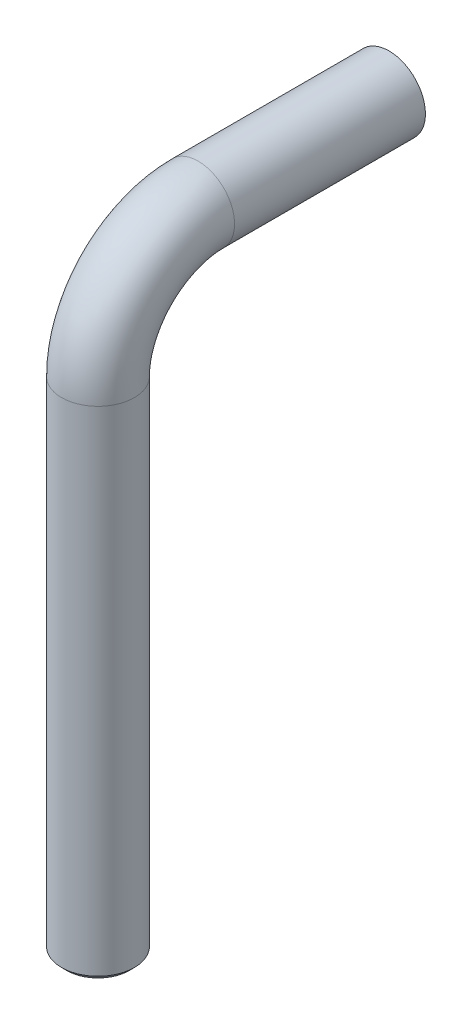
ISO-10303-21;
HEADER;
FILE_DESCRIPTION(('STEP AP214'),'2;1');
FILE_NAME('part.step','',(''),(''),'','','');
FILE_SCHEMA(('AUTOMOTIVE_DESIGN { 1 0 10303 214 1 1 1 1 }'));
ENDSEC;
DATA;
#1=APPLICATION_CONTEXT('core data for automotive mechanical design processes');
#2=APPLICATION_PROTOCOL_DEFINITION('international standard','automotive_design',2000,#1);
#3=PRODUCT_CONTEXT('',#1,'mechanical');
#4=PRODUCT('Part','Part','',(#3));
#5=PRODUCT_RELATED_PRODUCT_CATEGORY('part','',(#4));
#6=PRODUCT_DEFINITION_FORMATION('','',#4);
#7=PRODUCT_DEFINITION_CONTEXT('part definition',#1,'design');
#8=PRODUCT_DEFINITION('design','',#6,#7);
#9=PRODUCT_DEFINITION_SHAPE('','',#8);
#10=(LENGTH_UNIT() NAMED_UNIT(*) SI_UNIT(.MILLI.,.METRE.));
#11=(NAMED_UNIT(*) PLANE_ANGLE_UNIT() SI_UNIT($,.RADIAN.));
#12=(NAMED_UNIT(*) SI_UNIT($,.STERADIAN.) SOLID_ANGLE_UNIT());
#13=UNCERTAINTY_MEASURE_WITH_UNIT(LENGTH_MEASURE(1.E-05),#10,'distance_accuracy_value','');
#14=(GEOMETRIC_REPRESENTATION_CONTEXT(3) GLOBAL_UNCERTAINTY_ASSIGNED_CONTEXT((#13)) GLOBAL_UNIT_ASSIGNED_CONTEXT((#10,
#11,#12)) REPRESENTATION_CONTEXT('',''));
#15=CARTESIAN_POINT('',(0.,0.,0.));
#16=DIRECTION('',(0.,0.,1.));
#17=DIRECTION('',(1.,0.,0.));
#18=AXIS2_PLACEMENT_3D('',#15,#16,#17);
#19=CARTESIAN_POINT('',(7.084,-7.084,0.));
#20=DIRECTION('',(0.,0.,-1.));
#21=DIRECTION('',(-1.,0.,0.));
#22=AXIS2_PLACEMENT_3D('',#19,#20,#21);
#23=PLANE('',#22);
#24=CARTESIAN_POINT('',(-7.,-1.91429941660033E-09,0.));
#25=CARTESIAN_POINT('',(-6.99999891509851,0.196537843364104,0.));
#26=CARTESIAN_POINT('',(-6.99171583277586,0.393111316923906,0.));
#27=CARTESIAN_POINT('',(-6.95863478243086,0.784902996405907,0.));
#28=CARTESIAN_POINT('',(-6.93383193869678,0.980120785012645,0.));
#29=CARTESIAN_POINT('',(-6.86783123658557,1.368089954953,0.));
#30=CARTESIAN_POINT('',(-6.82660735302091,1.56083691741882,0.));
#31=CARTESIAN_POINT('',(-6.7280179483323,1.94232350827592,0.));
#32=CARTESIAN_POINT('',(-6.67063932812044,2.13105975044892,0.));
#33=CARTESIAN_POINT('',(-6.54027609809834,2.50269830515233,0.));
#34=CARTESIAN_POINT('',(-6.46731852835665,2.68561010287559,0.));
#35=CARTESIAN_POINT('',(-6.30622093211251,3.04472057343403,0.));
#36=CARTESIAN_POINT('',(-6.21807404509193,3.22091616867288,0.));
#37=CARTESIAN_POINT('',(-6.02724393962142,3.56526003396931,0.));
#38=CARTESIAN_POINT('',(-5.92456017435632,3.73340800099105,0.));
#39=CARTESIAN_POINT('',(-5.70543879336831,4.06037952617178,0.));
#40=CARTESIAN_POINT('',(-5.58900741164614,4.2192072621471,0.));
#41=CARTESIAN_POINT('',(-5.3431015333083,4.52659138815728,0.));
#42=CARTESIAN_POINT('',(-5.21361865727475,4.67514107487068,0.));
#43=CARTESIAN_POINT('',(-4.94272477354184,4.96066133858248,0.));
#44=CARTESIAN_POINT('',(-4.80132538672348,5.09764294149686,0.));
#45=CARTESIAN_POINT('',(-4.50742847418091,5.35927350480671,0.));
#46=CARTESIAN_POINT('',(-4.35492595010818,5.48391685050972,0.));
#47=CARTESIAN_POINT('',(-4.03992693399899,5.71994163914791,0.));
#48=CARTESIAN_POINT('',(-3.87742813542729,5.83132000379004,0.));
#49=CARTESIAN_POINT('',(-3.54368055722162,6.0399539706526,0.));
#50=CARTESIAN_POINT('',(-3.37243475130826,6.13721432993625,0.));
#51=CARTESIAN_POINT('',(-3.02229506377335,6.31699903732685,0.));
#52=CARTESIAN_POINT('',(-2.84339838718572,6.3995179421954,0.));
#53=CARTESIAN_POINT('',(-2.47935795885249,6.54916017127648,0.));
#54=CARTESIAN_POINT('',(-2.29421661919292,6.61628936359377,0.));
#55=CARTESIAN_POINT('',(-1.91886742245351,6.73473767043591,0.));
#56=CARTESIAN_POINT('',(-1.72865769506266,6.78605085832031,0.));
#57=CARTESIAN_POINT('',(-1.3446696181136,6.87245049550629,0.));
#58=CARTESIAN_POINT('',(-1.15089275696516,6.90754356003006,0.));
#59=CARTESIAN_POINT('',(-0.760983453149633,6.96129667140605,0.));
#60=CARTESIAN_POINT('',(-0.564849982830857,6.97994926434688,0.));
#61=CARTESIAN_POINT('',(-0.17170886107243,7.0006616332308,0.));
#62=CARTESIAN_POINT('',(0.0252987903672222,7.00272140917389,0.));
#63=CARTESIAN_POINT('',(0.418697806180246,6.99023635643656,0.));
#64=CARTESIAN_POINT('',(0.615089409281938,6.97569904838587,0.));
#65=CARTESIAN_POINT('',(1.00603037545227,6.93012601343414,0.));
#66=CARTESIAN_POINT('',(1.20057895345833,6.89908355153457,0.));
#67=CARTESIAN_POINT('',(1.58629644040987,6.82073151807987,0.));
#68=CARTESIAN_POINT('',(1.77746658655911,6.77342803688245,0.));
#69=CARTESIAN_POINT('',(2.15521567208457,6.66286647679002,0.));
#70=CARTESIAN_POINT('',(2.34179282933049,6.59960230882084,0.));
#71=CARTESIAN_POINT('',(2.70888540741974,6.4576044887307,0.));
#72=CARTESIAN_POINT('',(2.88940303579748,6.37887654340142,0.));
#73=CARTESIAN_POINT('',(3.24322564239427,6.20646673756665,0.));
#74=CARTESIAN_POINT('',(3.4165281632127,6.11277983386307,0.));
#75=CARTESIAN_POINT('',(3.75458414244703,5.91116079729822,0.));
#76=CARTESIAN_POINT('',(3.9193395711717,5.8032319680526,0.));
#77=CARTESIAN_POINT('',(4.23910084322865,5.57393156301064,0.));
#78=CARTESIAN_POINT('',(4.39411106726421,5.45256609603564,0.));
#79=CARTESIAN_POINT('',(4.69350691037047,5.19709115330211,0.));
#80=CARTESIAN_POINT('',(4.83788213146208,5.06296949157914,0.));
#81=CARTESIAN_POINT('',(5.11472568875869,4.78312605908963,0.));
#82=CARTESIAN_POINT('',(5.24720165362922,4.63741183501937,0.));
#83=CARTESIAN_POINT('',(5.49946717453756,4.33527500368971,0.));
#84=CARTESIAN_POINT('',(5.61925097007774,4.1788475866921,0.));
#85=CARTESIAN_POINT('',(5.84520726613122,3.8564618255379,0.));
#86=CARTESIAN_POINT('',(5.95138027859047,3.69050384019727,0.));
#87=CARTESIAN_POINT('',(6.14932029190583,3.35030901850082,0.));
#88=CARTESIAN_POINT('',(6.24109379191638,3.17607596358646,0.));
#89=CARTESIAN_POINT('',(6.40978599467957,2.82019293812676,0.));
#90=CARTESIAN_POINT('',(6.48667880373029,2.63853069360937,0.));
#91=CARTESIAN_POINT('',(6.62480787986965,2.26951545267121,0.));
#92=CARTESIAN_POINT('',(6.68605681771731,2.08216720013533,0.));
#93=CARTESIAN_POINT('',(6.79245876905863,1.70328094510092,0.));
#94=CARTESIAN_POINT('',(6.8376371993455,1.51175007165545,0.));
#95=CARTESIAN_POINT('',(6.91170339676888,1.12560337103086,0.));
#96=CARTESIAN_POINT('',(6.94059596877539,0.930988471181963,0.));
#97=CARTESIAN_POINT('',(6.97415548049398,0.613393017569114,0.));
#98=CARTESIAN_POINT('',(6.98384414946197,0.490921235047915,0.));
#99=CARTESIAN_POINT('',(6.99676674823848,0.245637606525265,0.));
#100=CARTESIAN_POINT('',(7.00000067804701,0.122825760523812,0.));
#101=CARTESIAN_POINT('',(6.999998915033,-0.196537845698365,0.));
#102=CARTESIAN_POINT('',(6.99171583264476,-0.393111319255954,0.));
#103=CARTESIAN_POINT('',(6.95863478216895,-0.784902998727887,0.));
#104=CARTESIAN_POINT('',(6.93383193836967,-0.980120787326772,0.));
#105=CARTESIAN_POINT('',(6.867831236129,-1.36808995724492,0.));
#106=CARTESIAN_POINT('',(6.82660735250015,-1.56083691969639,0.));
#107=CARTESIAN_POINT('',(6.72801794768457,-1.94232351051955,0.));
#108=CARTESIAN_POINT('',(6.67063932740992,-2.13105975267294,0.));
#109=CARTESIAN_POINT('',(6.5402760972641,-2.50269830733243,0.));
#110=CARTESIAN_POINT('',(6.46731852746144,-2.68561010503139,0.));
#111=CARTESIAN_POINT('',(6.30622093109758,-3.04472057553614,0.));
#112=CARTESIAN_POINT('',(6.21807404401827,-3.22091617074562,0.));
#113=CARTESIAN_POINT('',(6.02724393843297,-3.56526003597845,0.));
#114=CARTESIAN_POINT('',(5.92456017311182,-3.73340800296595,0.));
#115=CARTESIAN_POINT('',(5.70543879201484,-4.06037952807361,0.));
#116=CARTESIAN_POINT('',(5.58900741023973,-4.21920726401011,0.));
#117=CARTESIAN_POINT('',(5.34310153179942,-4.52659138993833,0.));
#118=CARTESIAN_POINT('',(5.21361865571633,-4.6751410766086,0.));
#119=CARTESIAN_POINT('',(4.9427247718882,-4.96066134023014,0.));
#120=CARTESIAN_POINT('',(4.80132538502416,-5.09764294309741,0.));
#121=CARTESIAN_POINT('',(4.50742847239436,-5.35927350630929,0.));
#122=CARTESIAN_POINT('',(4.35492594828011,-5.48391685196144,0.));
#123=CARTESIAN_POINT('',(4.03992693209229,-5.71994164049459,0.));
#124=CARTESIAN_POINT('',(3.87742813348349,-5.83132000508253,0.));
#125=CARTESIAN_POINT('',(3.5436805552083,-6.03995397183382,0.));
#126=CARTESIAN_POINT('',(3.37243474926254,-6.13721433106039,0.));
#127=CARTESIAN_POINT('',(3.02229506166771,-6.31699903833427,0.));
#128=CARTESIAN_POINT('',(2.84339838505258,-6.39951794314319,0.));
#129=CARTESIAN_POINT('',(2.47935795666947,-6.54916017210292,0.));
#130=CARTESIAN_POINT('',(2.29421661698751,-6.61628936435851,0.));
#131=CARTESIAN_POINT('',(1.91886742020861,-6.73473767107553,0.));
#132=CARTESIAN_POINT('',(1.72865769280065,-6.78605085889653,0.));
#133=CARTESIAN_POINT('',(1.34466961582279,-6.87245049595451,0.));
#134=CARTESIAN_POINT('',(1.15089275466264,-6.90754356041369,0.));
#135=CARTESIAN_POINT('',(0.760983450829197,-6.96129667165971,0.));
#136=CARTESIAN_POINT('',(0.564849980504203,-6.97994926453516,0.));
#137=CARTESIAN_POINT('',(0.171708858738871,-7.00066163328804,0.));
#138=CARTESIAN_POINT('',(-0.0252987927014662,-7.00272140916546,0.));
#139=CARTESIAN_POINT('',(-0.418697808510325,-6.99023635629699,0.));
#140=CARTESIAN_POINT('',(-0.61508941160717,-6.97569904818084,0.));
#141=CARTESIAN_POINT('',(-1.00603037776231,-6.9301260130988,0.));
#142=CARTESIAN_POINT('',(-1.20057895575801,-6.89908355113438,0.));
#143=CARTESIAN_POINT('',(-1.58629644268342,-6.82073151755111,0.));
#144=CARTESIAN_POINT('',(-1.77746658881689,-6.77342803628997,0.));
#145=CARTESIAN_POINT('',(-2.1552156743055,-6.66286647607163,0.));
#146=CARTESIAN_POINT('',(-2.34179283153034,-6.59960230804025,0.));
#147=CARTESIAN_POINT('',(-2.70888540957226,-6.45760448782775,0.));
#148=CARTESIAN_POINT('',(-2.88940303792377,-6.37887654243829,0.));
#149=CARTESIAN_POINT('',(-3.24322564446312,-6.20646673648556,0.));
#150=CARTESIAN_POINT('',(-3.41652816525035,-6.11277983272419,0.));
#151=CARTESIAN_POINT('',(-3.75458414441752,-5.91116079604663,0.));
#152=CARTESIAN_POINT('',(-3.91933957310624,-5.80323196674606,0.));
#153=CARTESIAN_POINT('',(-4.23910084508675,-5.57393156159751,0.));
#154=CARTESIAN_POINT('',(-4.39411106908182,-5.45256609457086,0.));
#155=CARTESIAN_POINT('',(-4.69350691210287,-5.19709115173757,0.));
#156=CARTESIAN_POINT('',(-4.83788213314975,-5.06296948996649,0.));
#157=CARTESIAN_POINT('',(-5.11472569035307,-4.78312605738471,0.));
#158=CARTESIAN_POINT('',(-5.24720165517504,-4.63741183327029,0.));
#159=CARTESIAN_POINT('',(-5.49946717598268,-4.33527500185652,0.));
#160=CARTESIAN_POINT('',(-5.61925097147072,-4.17884758481897,0.));
#161=CARTESIAN_POINT('',(-5.84520726741674,-3.85646182358945,0.));
#162=CARTESIAN_POINT('',(-5.95138027982067,-3.69050383821343,0.));
#163=CARTESIAN_POINT('',(-6.1493202930226,-3.35030901645102,0.));
#164=CARTESIAN_POINT('',(-6.24109379297507,-3.17607596150609,0.));
#165=CARTESIAN_POINT('',(-6.40978599561984,-2.82019293598972,0.));
#166=CARTESIAN_POINT('',(-6.48667880461019,-2.63853069144623,0.));
#167=CARTESIAN_POINT('',(-6.62480788062685,-2.26951545046096,0.));
#168=CARTESIAN_POINT('',(-6.68605681841218,-2.08216719790408,0.));
#169=CARTESIAN_POINT('',(-6.79245876962708,-1.70328094283398,0.));
#170=CARTESIAN_POINT('',(-6.83763719984994,-1.51175006937385,0.));
#171=CARTESIAN_POINT('',(-6.9117033971443,-1.1256033687255,0.));
#172=CARTESIAN_POINT('',(-6.94059596908581,-0.930988468867508,0.));
#173=CARTESIAN_POINT('',(-6.97415548061672,-0.613393016017886,0.));
#174=CARTESIAN_POINT('',(-6.98384414950289,-0.490921234271224,0.));
#175=CARTESIAN_POINT('',(-6.99676674819756,-0.245637607301956,0.));
#176=CARTESIAN_POINT('',(-7.00000067800606,-0.12282576207935,0.));
#177=CARTESIAN_POINT('',(-7.,-1.91429941660033E-09,0.));
#178=B_SPLINE_CURVE_WITH_KNOTS('',3,(#24,#25,#26,#27,#28,#29,#30,#31,#32,#33,#34,#35,#36,#37,
#38,#39,#40,#41,#42,#43,#44,#45,#46,#47,#48,#49,#50,#51,#52,#53,#54,#55,#56,#57,#58,#59,#60,#61,
#62,#63,#64,#65,#66,#67,#68,#69,#70,#71,#72,#73,#74,#75,#76,#77,#78,#79,#80,#81,#82,#83,#84,#85,
#86,#87,#88,#89,#90,#91,#92,#93,#94,#95,#96,#97,#98,#99,#100,#101,#102,#103,#104,#105,#106,#107,
#108,#109,#110,#111,#112,#113,#114,#115,#116,#117,#118,#119,#120,#121,#122,#123,#124,#125,#126,
#127,#128,#129,#130,#131,#132,#133,#134,#135,#136,#137,#138,#139,#140,#141,#142,#143,#144,#145,
#146,#147,#148,#149,#150,#151,#152,#153,#154,#155,#156,#157,#158,#159,#160,#161,#162,#163,#164,
#165,#166,#167,#168,#169,#170,#171,#172,#173,#174,#175,#176,#177),.UNSPECIFIED.,.T.,.F.,(4,2,2,
2,2,2,2,2,2,2,2,2,2,2,2,2,2,2,2,2,2,2,2,2,2,2,2,2,2,2,2,2,2,2,2,2,2,2,2,2,2,2,2,2,2,2,2,2,2,2,2,
2,2,2,2,2,2,2,2,2,2,2,2,2,2,2,2,2,2,2,2,2,2,2,2,2,4),(0.,0.58950107109514,1.17917620715641,
1.76978964293131,2.36088336442639,2.95095935678712,3.54130256912935,4.13166799356071,
4.72176673135701,5.31224677154243,5.90215750003368,6.49233545313817,7.08265009813346,
7.67276537252193,8.26309809685945,8.85320535127168,9.44353346509982,10.0336206063469,
10.6239751485653,11.2143296907838,11.8044168320308,12.394744945859,12.9848522002713,
13.5751849246088,14.1653001989972,14.7556148439924,15.3457927970968,15.9357035255881,
16.5261835657737,17.1162823035699,17.7066477280012,18.2969909403435,18.8870669327043,
19.4781606541979,20.068774089971,20.6584492260334,21.2479502971307,21.6163572954431,
21.9847642937555,22.5742653648527,23.1639405009151,23.7545539366883,24.3456476581818,
24.9357236505426,25.5260668628849,26.1164322873162,26.7065310251125,27.297011065298,
27.8869217937893,28.4770997468937,29.0674143918889,29.6575296662774,30.2478623906149,
30.8379696450271,31.4282977588553,32.0183849001023,32.6087394423208,33.1990939845393,
33.7891811257863,34.3795092396144,34.9696164940267,35.5599492183642,36.1500644927527,
36.740379137748,37.3305570908525,37.9204678193437,38.5109478595291,39.1010465973254,
39.6914120217568,40.281755234099,40.8718312264597,41.4629249479548,42.0535383837297,
42.643213519791,43.2327145908861,43.601121586866,43.9695285828458),.UNSPECIFIED.);
#179=CARTESIAN_POINT('',(-7.,-1.91429941660033E-09,0.));
#180=VERTEX_POINT('',#179);
#181=EDGE_CURVE('E49',#180,#180,#178,.T.);
#182=ORIENTED_EDGE('',*,*,#181,.T.);
#183=EDGE_LOOP('',(#182));
#184=FACE_BOUND('',#183,.T.);
#185=ADVANCED_FACE('F17',(#184),#23,.T.);
#186=CARTESIAN_POINT('',(-6.072,-115.28484673,49.948732444));
#187=DIRECTION('',(0.,1.,0.));
#188=DIRECTION('',(0.,0.,1.));
#189=AXIS2_PLACEMENT_3D('',#186,#187,#188);
#190=PLANE('',#189);
#191=CARTESIAN_POINT('',(0.,-115.28484673,56.020732444));
#192=DIRECTION('',(0.,1.,0.));
#193=DIRECTION('',(0.,0.,1.));
#194=AXIS2_PLACEMENT_3D('',#191,#192,#193);
#195=CIRCLE('',#194,6.);
#196=CARTESIAN_POINT('',(-7.18345474746111E-10,-115.28484673,62.020732444));
#197=VERTEX_POINT('',#196);
#198=CARTESIAN_POINT('',(-2.05103428528839E-09,-115.28484673,50.020732444));
#199=VERTEX_POINT('',#198);
#200=EDGE_CURVE('E21',#197,#199,#195,.F.);
#201=ORIENTED_EDGE('',*,*,#200,.T.);
#202=CARTESIAN_POINT('',(0.,-115.28484673,56.020732444));
#203=DIRECTION('',(0.,1.,0.));
#204=DIRECTION('',(0.,0.,1.));
#205=AXIS2_PLACEMENT_3D('',#202,#203,#204);
#206=CIRCLE('',#205,6.);
#207=EDGE_CURVE('E47',#199,#197,#206,.F.);
#208=ORIENTED_EDGE('',*,*,#207,.T.);
#209=EDGE_LOOP('',(#201,#208));
#210=FACE_BOUND('',#209,.T.);
#211=ADVANCED_FACE('F45',(#210),#190,.F.);
#212=CARTESIAN_POINT('',(0.,-115.28484673,62.020732444));
#213=CARTESIAN_POINT('',(0.,-114.28484673,63.020732444));
#214=(BOUNDED_CURVE() B_SPLINE_CURVE(1,(#212,#213),.UNSPECIFIED.,.F.,
.F.) B_SPLINE_CURVE_WITH_KNOTS((2,2),(0.,0.999999999999972),
.UNSPECIFIED.) CURVE() GEOMETRIC_REPRESENTATION_ITEM() RATIONAL_B_SPLINE_CURVE((1.,1.)) REPRESENTATION_ITEM(''));
#215=CARTESIAN_POINT('',(0.,-1114.28484673,56.020732444));
#216=DIRECTION('',(0.,1.,0.));
#217=AXIS1_PLACEMENT('',#215,#216);
#218=SURFACE_OF_REVOLUTION('',#214,#217);
#219=ORIENTED_EDGE('',*,*,#200,.F.);
#220=DIRECTION('',(-1.26986739101621E-10,0.707106781186547,0.707106781186547));
#221=VECTOR('',#220,1.);
#222=CARTESIAN_POINT('',(-1.1673113964138E-09,-114.78484673,62.520732444));
#223=LINE('',#222,#221);
#224=CARTESIAN_POINT('',(-1.43572399960732E-09,-114.28484673,63.020732444));
#225=VERTEX_POINT('',#224);
#226=EDGE_CURVE('E37',#197,#225,#223,.T.);
#227=ORIENTED_EDGE('',*,*,#226,.T.);
#228=CARTESIAN_POINT('',(0.,-114.28484673,56.020732444));
#229=DIRECTION('',(0.,1.,0.));
#230=DIRECTION('',(0.,0.,1.));
#231=AXIS2_PLACEMENT_3D('',#228,#229,#230);
#232=CIRCLE('',#231,7.);
#233=CARTESIAN_POINT('',(-2.06427628998399E-09,-114.28484673,49.020732444));
#234=VERTEX_POINT('',#233);
#235=EDGE_CURVE('E54',#225,#234,#232,.F.);
#236=ORIENTED_EDGE('',*,*,#235,.T.);
#237=DIRECTION('',(2.900600502956E-10,-0.707106781186547,0.707106781186547));
#238=VECTOR('',#237,1.);
#239=CARTESIAN_POINT('',(-2.66634457069931E-09,-114.78484673,49.520732444));
#240=LINE('',#239,#238);
#241=EDGE_CURVE('E51',#234,#199,#240,.T.);
#242=ORIENTED_EDGE('',*,*,#241,.T.);
#243=EDGE_LOOP('',(#219,#227,#236,#242));
#244=FACE_BOUND('',#243,.T.);
#245=ADVANCED_FACE('F52',(#244),#218,.T.);
#246=CARTESIAN_POINT('',(7.,0.,0.));
#247=CARTESIAN_POINT('',(7.,0.,36.735885714));
#248=(BOUNDED_CURVE() B_SPLINE_CURVE(1,(#246,#247),.UNSPECIFIED.,.F.,
.F.) B_SPLINE_CURVE_WITH_KNOTS((2,2),(0.,1.),
.UNSPECIFIED.) CURVE() GEOMETRIC_REPRESENTATION_ITEM() RATIONAL_B_SPLINE_CURVE((1.,1.)) REPRESENTATION_ITEM(''));
#249=CARTESIAN_POINT('',(0.,0.,0.));
#250=DIRECTION('',(0.,0.,1.));
#251=AXIS1_PLACEMENT('',#249,#250);
#252=SURFACE_OF_REVOLUTION('',#248,#251);
#253=CARTESIAN_POINT('',(0.,0.,36.735885714));
#254=DIRECTION('',(0.,0.,-1.));
#255=DIRECTION('',(0.,1.,0.));
#256=AXIS2_PLACEMENT_3D('',#253,#254,#255);
#257=CIRCLE('',#256,7.);
#258=CARTESIAN_POINT('',(0.,7.,36.735885714));
#259=VERTEX_POINT('',#258);
#260=EDGE_CURVE('E66',#259,#259,#257,.F.);
#261=ORIENTED_EDGE('',*,*,#260,.F.);
#262=EDGE_LOOP('',(#261));
#263=FACE_BOUND('',#262,.T.);
#264=ORIENTED_EDGE('',*,*,#181,.F.);
#265=EDGE_LOOP('',(#264));
#266=FACE_BOUND('',#265,.T.);
#267=ADVANCED_FACE('F78',(#263,#266),#252,.T.);
#268=CARTESIAN_POINT('',(0.,-115.284988151356,62.0205910226438));
#269=CARTESIAN_POINT('',(0.,-115.28484673,62.020732444));
#270=CARTESIAN_POINT('',(0.,-114.28484673,63.020732444));
#271=(BOUNDED_CURVE() B_SPLINE_CURVE(1,(#268,#269,#270),.UNSPECIFIED.,.F.,
.F.) B_SPLINE_CURVE_WITH_KNOTS((2,1,2),(-0.00014142133217493,2.4058977032837E-11,1.),
.UNSPECIFIED.) CURVE() GEOMETRIC_REPRESENTATION_ITEM() RATIONAL_B_SPLINE_CURVE((1.,1.,1.)) REPRESENTATION_ITEM(''));
#272=CARTESIAN_POINT('',(0.,-1114.28484673,56.020732444));
#273=DIRECTION('',(0.,1.,0.));
#274=AXIS1_PLACEMENT('',#272,#273);
#275=SURFACE_OF_REVOLUTION('',#271,#274);
#276=ORIENTED_EDGE('',*,*,#241,.F.);
#277=CARTESIAN_POINT('',(0.,-114.28484673,56.020732444));
#278=DIRECTION('',(0.,1.,0.));
#279=DIRECTION('',(0.,0.,1.));
#280=AXIS2_PLACEMENT_3D('',#277,#278,#279);
#281=CIRCLE('',#280,7.);
#282=EDGE_CURVE('E28',#234,#225,#281,.F.);
#283=ORIENTED_EDGE('',*,*,#282,.T.);
#284=ORIENTED_EDGE('',*,*,#226,.F.);
#285=ORIENTED_EDGE('',*,*,#207,.F.);
#286=EDGE_LOOP('',(#276,#283,#284,#285));
#287=FACE_BOUND('',#286,.T.);
#288=ADVANCED_FACE('F59',(#287),#275,.T.);
#289=CARTESIAN_POINT('',(0.,-19.28484673,36.735885714));
#290=DIRECTION('',(1.,0.,0.));
#291=DIRECTION('',(0.,0.,-1.));
#292=AXIS2_PLACEMENT_3D('',#289,#290,#291);
#293=TOROIDAL_SURFACE('',#292,19.28484673,7.);
#294=CARTESIAN_POINT('',(0.,-19.28484673,56.020732444));
#295=DIRECTION('',(0.,1.,0.));
#296=DIRECTION('',(0.,0.,1.));
#297=AXIS2_PLACEMENT_3D('',#294,#295,#296);
#298=CIRCLE('',#297,7.);
#299=CARTESIAN_POINT('',(0.,-19.28484673,63.020732444));
#300=VERTEX_POINT('',#299);
#301=EDGE_CURVE('E11',#300,#300,#298,.T.);
#302=CARTESIAN_POINT('',(0.,-19.28484673,36.735885714));
#303=DIRECTION('',(1.,0.,0.));
#304=DIRECTION('',(0.,0.,-1.));
#305=AXIS2_PLACEMENT_3D('',#302,#303,#304);
#306=CIRCLE('',#305,26.28484673);
#307=EDGE_CURVE('',#259,#300,#306,.T.);
#308=ORIENTED_EDGE('',*,*,#260,.T.);
#309=ORIENTED_EDGE('',*,*,#301,.T.);
#310=ORIENTED_EDGE('',*,*,#307,.T.);
#311=ORIENTED_EDGE('',*,*,#307,.F.);
#312=EDGE_LOOP('',(#308,#310,#309,#311));
#313=FACE_BOUND('',#312,.T.);
#314=ADVANCED_FACE('F19',(#313),#293,.T.);
#315=CARTESIAN_POINT('',(0.,-19.28484673,49.020732444));
#316=CARTESIAN_POINT('',(0.,-114.28484673,49.020732444));
#317=(BOUNDED_CURVE() B_SPLINE_CURVE(1,(#315,#316),.UNSPECIFIED.,.F.,
.F.) B_SPLINE_CURVE_WITH_KNOTS((2,2),(0.,1.),
.UNSPECIFIED.) CURVE() GEOMETRIC_REPRESENTATION_ITEM() RATIONAL_B_SPLINE_CURVE((1.,1.)) REPRESENTATION_ITEM(''));
#318=CARTESIAN_POINT('',(0.,-19.28484673,56.020732444));
#319=DIRECTION('',(0.,-1.,0.));
#320=AXIS1_PLACEMENT('',#318,#319);
#321=SURFACE_OF_REVOLUTION('',#317,#320);
#322=ORIENTED_EDGE('',*,*,#282,.F.);
#323=ORIENTED_EDGE('',*,*,#235,.F.);
#324=EDGE_LOOP('',(#322,#323));
#325=FACE_BOUND('',#324,.T.);
#326=ORIENTED_EDGE('',*,*,#301,.F.);
#327=EDGE_LOOP('',(#326));
#328=FACE_BOUND('',#327,.T.);
#329=ADVANCED_FACE('F92',(#325,#328),#321,.T.);
#330=CLOSED_SHELL('',(#185,#211,#245,#267,#288,#314,#329));
#331=MANIFOLD_SOLID_BREP('B1',#330);
#332=ADVANCED_BREP_SHAPE_REPRESENTATION('',(#18,#331),#14);
#333=SHAPE_DEFINITION_REPRESENTATION(#9,#332);
ENDSEC;
END-ISO-10303-21;
